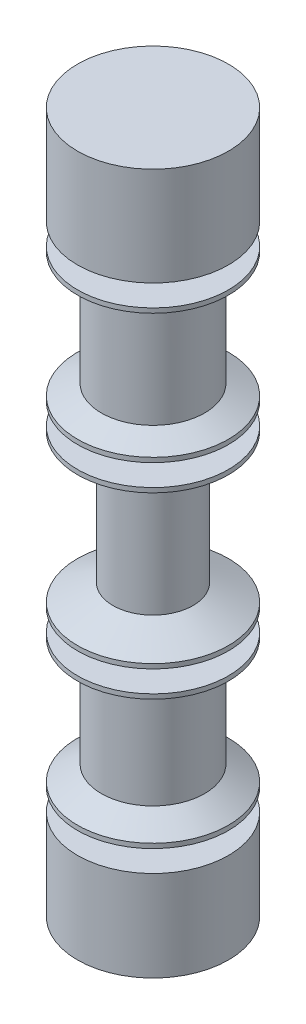
ISO-10303-21;
HEADER;
FILE_DESCRIPTION(('STEP AP214'),'2;1');
FILE_NAME('part.step','',(''),(''),'','','');
FILE_SCHEMA(('AUTOMOTIVE_DESIGN { 1 0 10303 214 1 1 1 1 }'));
ENDSEC;
DATA;
#1=APPLICATION_CONTEXT('core data for automotive mechanical design processes');
#2=APPLICATION_PROTOCOL_DEFINITION('international standard','automotive_design',2000,#1);
#3=PRODUCT_CONTEXT('',#1,'mechanical');
#4=PRODUCT('Part','Part','',(#3));
#5=PRODUCT_RELATED_PRODUCT_CATEGORY('part','',(#4));
#6=PRODUCT_DEFINITION_FORMATION('','',#4);
#7=PRODUCT_DEFINITION_CONTEXT('part definition',#1,'design');
#8=PRODUCT_DEFINITION('design','',#6,#7);
#9=PRODUCT_DEFINITION_SHAPE('','',#8);
#10=(LENGTH_UNIT() NAMED_UNIT(*) SI_UNIT(.MILLI.,.METRE.));
#11=(NAMED_UNIT(*) PLANE_ANGLE_UNIT() SI_UNIT($,.RADIAN.));
#12=(NAMED_UNIT(*) SI_UNIT($,.STERADIAN.) SOLID_ANGLE_UNIT());
#13=UNCERTAINTY_MEASURE_WITH_UNIT(LENGTH_MEASURE(1.E-05),#10,'distance_accuracy_value','');
#14=(GEOMETRIC_REPRESENTATION_CONTEXT(3) GLOBAL_UNCERTAINTY_ASSIGNED_CONTEXT((#13)) GLOBAL_UNIT_ASSIGNED_CONTEXT((#10,
#11,#12)) REPRESENTATION_CONTEXT('',''));
#15=CARTESIAN_POINT('',(0.,0.,0.));
#16=DIRECTION('',(0.,0.,1.));
#17=DIRECTION('',(1.,0.,0.));
#18=AXIS2_PLACEMENT_3D('',#15,#16,#17);
#19=CARTESIAN_POINT('',(0.,-23.,0.));
#20=DIRECTION('',(0.,1.,0.));
#21=DIRECTION('',(0.,0.,1.));
#22=AXIS2_PLACEMENT_3D('',#19,#20,#21);
#23=CYLINDRICAL_SURFACE('',#22,4.9);
#24=CARTESIAN_POINT('',(0.,-16.6,0.));
#25=DIRECTION('',(0.,1.,0.));
#26=DIRECTION('',(0.,0.,1.));
#27=AXIS2_PLACEMENT_3D('',#24,#25,#26);
#28=CIRCLE('',#27,4.9);
#29=CARTESIAN_POINT('',(0.,-16.6,4.9));
#30=VERTEX_POINT('',#29);
#31=EDGE_CURVE('E55',#30,#30,#28,.T.);
#32=ORIENTED_EDGE('',*,*,#31,.F.);
#33=EDGE_LOOP('',(#32));
#34=FACE_BOUND('',#33,.T.);
#35=CARTESIAN_POINT('',(0.,-22.4803847577293,0.));
#36=DIRECTION('',(0.,1.,0.));
#37=DIRECTION('',(0.,0.,1.));
#38=AXIS2_PLACEMENT_3D('',#35,#36,#37);
#39=CIRCLE('',#38,4.9);
#40=CARTESIAN_POINT('',(0.,-22.4803847577293,4.9));
#41=VERTEX_POINT('',#40);
#42=EDGE_CURVE('E530',#41,#41,#39,.T.);
#43=ORIENTED_EDGE('',*,*,#42,.T.);
#44=EDGE_LOOP('',(#43));
#45=FACE_BOUND('',#44,.T.);
#46=ADVANCED_FACE('F33',(#34,#45),#23,.T.);
#47=CARTESIAN_POINT('',(0.,3.7,0.));
#48=DIRECTION('',(0.,-1.,0.));
#49=DIRECTION('',(0.,0.,-1.));
#50=AXIS2_PLACEMENT_3D('',#47,#48,#49);
#51=CYLINDRICAL_SURFACE('',#50,2.6);
#52=CARTESIAN_POINT('',(0.,3.7,0.));
#53=DIRECTION('',(0.,1.,0.));
#54=DIRECTION('',(0.,0.,1.));
#55=AXIS2_PLACEMENT_3D('',#52,#53,#54);
#56=CIRCLE('',#55,2.6);
#57=CARTESIAN_POINT('',(0.,3.7,2.6));
#58=VERTEX_POINT('',#57);
#59=EDGE_CURVE('E37',#58,#58,#56,.T.);
#60=ORIENTED_EDGE('',*,*,#59,.F.);
#61=EDGE_LOOP('',(#60));
#62=FACE_BOUND('',#61,.T.);
#63=CARTESIAN_POINT('',(0.,-3.7,0.));
#64=DIRECTION('',(0.,1.,0.));
#65=DIRECTION('',(-1.,0.,0.));
#66=AXIS2_PLACEMENT_3D('',#63,#64,#65);
#67=CIRCLE('',#66,2.6);
#68=CARTESIAN_POINT('',(-2.6,-3.7,0.));
#69=VERTEX_POINT('',#68);
#70=EDGE_CURVE('E101',#69,#69,#67,.T.);
#71=ORIENTED_EDGE('',*,*,#70,.T.);
#72=EDGE_LOOP('',(#71));
#73=FACE_BOUND('',#72,.T.);
#74=ADVANCED_FACE('F35',(#62,#73),#51,.T.);
#75=CARTESIAN_POINT('',(0.,3.7,0.));
#76=DIRECTION('',(0.,1.,0.));
#77=DIRECTION('',(-1.,0.,0.));
#78=AXIS2_PLACEMENT_3D('',#75,#76,#77);
#79=CONICAL_SURFACE('',#78,2.6,1.12469077785149);
#80=CARTESIAN_POINT('',(0.,4.8,0.));
#81=DIRECTION('',(0.,1.,0.));
#82=DIRECTION('',(-1.,0.,0.));
#83=AXIS2_PLACEMENT_3D('',#80,#81,#82);
#84=CIRCLE('',#83,4.9);
#85=CARTESIAN_POINT('',(-4.9,4.8,0.));
#86=VERTEX_POINT('',#85);
#87=EDGE_CURVE('E138',#86,#86,#84,.T.);
#88=ORIENTED_EDGE('',*,*,#87,.F.);
#89=EDGE_LOOP('',(#88));
#90=FACE_BOUND('',#89,.T.);
#91=ORIENTED_EDGE('',*,*,#59,.T.);
#92=EDGE_LOOP('',(#91));
#93=FACE_BOUND('',#92,.T.);
#94=ADVANCED_FACE('F145',(#90,#93),#79,.T.);
#95=CARTESIAN_POINT('',(0.,5.1,0.));
#96=DIRECTION('',(0.,1.,0.));
#97=DIRECTION('',(-1.,0.,0.));
#98=AXIS2_PLACEMENT_3D('',#95,#96,#97);
#99=CYLINDRICAL_SURFACE('',#98,4.9);
#100=CARTESIAN_POINT('',(0.,5.1,0.));
#101=DIRECTION('',(0.,1.,0.));
#102=DIRECTION('',(-1.,0.,0.));
#103=AXIS2_PLACEMENT_3D('',#100,#101,#102);
#104=CIRCLE('',#103,4.9);
#105=CARTESIAN_POINT('',(-4.9,5.1,0.));
#106=VERTEX_POINT('',#105);
#107=EDGE_CURVE('E134',#106,#106,#104,.T.);
#108=ORIENTED_EDGE('',*,*,#107,.F.);
#109=EDGE_LOOP('',(#108));
#110=FACE_BOUND('',#109,.T.);
#111=ORIENTED_EDGE('',*,*,#87,.T.);
#112=EDGE_LOOP('',(#111));
#113=FACE_BOUND('',#112,.T.);
#114=ADVANCED_FACE('F465',(#110,#113),#99,.T.);
#115=CARTESIAN_POINT('',(4.9,5.1,0.));
#116=DIRECTION('',(0.,-1.,0.));
#117=DIRECTION('',(1.,0.,0.));
#118=AXIS2_PLACEMENT_3D('',#115,#116,#117);
#119=PLANE('',#118);
#120=CARTESIAN_POINT('',(0.,5.1,0.));
#121=DIRECTION('',(0.,1.,0.));
#122=DIRECTION('',(-1.,0.,0.));
#123=AXIS2_PLACEMENT_3D('',#120,#121,#122);
#124=CIRCLE('',#123,2.5);
#125=CARTESIAN_POINT('',(-2.5,5.1,0.));
#126=VERTEX_POINT('',#125);
#127=EDGE_CURVE('E41',#126,#126,#124,.T.);
#128=ORIENTED_EDGE('',*,*,#127,.F.);
#129=EDGE_LOOP('',(#128));
#130=FACE_BOUND('',#129,.T.);
#131=ORIENTED_EDGE('',*,*,#107,.T.);
#132=EDGE_LOOP('',(#131));
#133=FACE_BOUND('',#132,.T.);
#134=ADVANCED_FACE('F456',(#130,#133),#119,.F.);
#135=CARTESIAN_POINT('',(0.,6.5,0.));
#136=DIRECTION('',(0.,-1.,0.));
#137=DIRECTION('',(1.,0.,0.));
#138=AXIS2_PLACEMENT_3D('',#135,#136,#137);
#139=CYLINDRICAL_SURFACE('',#138,2.5);
#140=CARTESIAN_POINT('',(0.,6.5,0.));
#141=DIRECTION('',(0.,1.,0.));
#142=DIRECTION('',(-1.,0.,0.));
#143=AXIS2_PLACEMENT_3D('',#140,#141,#142);
#144=CIRCLE('',#143,2.5);
#145=CARTESIAN_POINT('',(-2.5,6.5,0.));
#146=VERTEX_POINT('',#145);
#147=EDGE_CURVE('E131',#146,#146,#144,.T.);
#148=ORIENTED_EDGE('',*,*,#147,.F.);
#149=EDGE_LOOP('',(#148));
#150=FACE_BOUND('',#149,.T.);
#151=ORIENTED_EDGE('',*,*,#127,.T.);
#152=EDGE_LOOP('',(#151));
#153=FACE_BOUND('',#152,.T.);
#154=ADVANCED_FACE('F447',(#150,#153),#139,.T.);
#155=CARTESIAN_POINT('',(0.,6.5,0.));
#156=DIRECTION('',(0.,-1.,0.));
#157=DIRECTION('',(0.,0.,-1.));
#158=AXIS2_PLACEMENT_3D('',#155,#156,#157);
#159=PLANE('',#158);
#160=ORIENTED_EDGE('',*,*,#147,.T.);
#161=EDGE_LOOP('',(#160));
#162=FACE_BOUND('',#161,.T.);
#163=CARTESIAN_POINT('',(0.,6.5,0.));
#164=DIRECTION('',(0.,-1.,0.));
#165=DIRECTION('',(0.,0.,-1.));
#166=AXIS2_PLACEMENT_3D('',#163,#164,#165);
#167=CIRCLE('',#166,4.9);
#168=CARTESIAN_POINT('',(0.,6.5,-4.9));
#169=VERTEX_POINT('',#168);
#170=EDGE_CURVE('E128',#169,#169,#167,.T.);
#171=ORIENTED_EDGE('',*,*,#170,.T.);
#172=EDGE_LOOP('',(#171));
#173=FACE_BOUND('',#172,.T.);
#174=ADVANCED_FACE('F438',(#162,#173),#159,.T.);
#175=CARTESIAN_POINT('',(0.,6.5,0.));
#176=DIRECTION('',(0.,-1.,0.));
#177=DIRECTION('',(0.,0.,-1.));
#178=AXIS2_PLACEMENT_3D('',#175,#176,#177);
#179=CYLINDRICAL_SURFACE('',#178,4.9);
#180=CARTESIAN_POINT('',(0.,6.8,0.));
#181=DIRECTION('',(0.,-1.,0.));
#182=DIRECTION('',(0.,0.,-1.));
#183=AXIS2_PLACEMENT_3D('',#180,#181,#182);
#184=CIRCLE('',#183,4.9);
#185=CARTESIAN_POINT('',(0.,6.8,-4.9));
#186=VERTEX_POINT('',#185);
#187=EDGE_CURVE('E123',#186,#186,#184,.T.);
#188=ORIENTED_EDGE('',*,*,#187,.T.);
#189=EDGE_LOOP('',(#188));
#190=FACE_BOUND('',#189,.T.);
#191=ORIENTED_EDGE('',*,*,#170,.F.);
#192=EDGE_LOOP('',(#191));
#193=FACE_BOUND('',#192,.T.);
#194=ADVANCED_FACE('F429',(#190,#193),#179,.T.);
#195=CARTESIAN_POINT('',(0.,6.8,0.));
#196=DIRECTION('',(0.,-1.,0.));
#197=DIRECTION('',(0.,0.,-1.));
#198=AXIS2_PLACEMENT_3D('',#195,#196,#197);
#199=CONICAL_SURFACE('',#198,4.9,1.14660191889113);
#200=CARTESIAN_POINT('',(0.,7.5,0.));
#201=DIRECTION('',(0.,1.,0.));
#202=DIRECTION('',(-1.,0.,0.));
#203=AXIS2_PLACEMENT_3D('',#200,#201,#202);
#204=CIRCLE('',#203,3.35000000000001);
#205=CARTESIAN_POINT('',(-3.35000000000001,7.5,0.));
#206=VERTEX_POINT('',#205);
#207=EDGE_CURVE('E119',#206,#206,#204,.T.);
#208=ORIENTED_EDGE('',*,*,#207,.F.);
#209=EDGE_LOOP('',(#208));
#210=FACE_BOUND('',#209,.T.);
#211=ORIENTED_EDGE('',*,*,#187,.F.);
#212=EDGE_LOOP('',(#211));
#213=FACE_BOUND('',#212,.T.);
#214=ADVANCED_FACE('F420',(#210,#213),#199,.T.);
#215=CARTESIAN_POINT('',(0.,13.9,0.));
#216=DIRECTION('',(0.,-1.,0.));
#217=DIRECTION('',(1.,0.,0.));
#218=AXIS2_PLACEMENT_3D('',#215,#216,#217);
#219=CYLINDRICAL_SURFACE('',#218,3.35000000000001);
#220=CARTESIAN_POINT('',(0.,13.9,0.));
#221=DIRECTION('',(0.,1.,0.));
#222=DIRECTION('',(-1.,0.,0.));
#223=AXIS2_PLACEMENT_3D('',#220,#221,#222);
#224=CIRCLE('',#223,3.35000000000001);
#225=CARTESIAN_POINT('',(-3.35000000000001,13.9,0.));
#226=VERTEX_POINT('',#225);
#227=EDGE_CURVE('E120',#226,#226,#224,.T.);
#228=ORIENTED_EDGE('',*,*,#227,.F.);
#229=EDGE_LOOP('',(#228));
#230=FACE_BOUND('',#229,.T.);
#231=ORIENTED_EDGE('',*,*,#207,.T.);
#232=EDGE_LOOP('',(#231));
#233=FACE_BOUND('',#232,.T.);
#234=ADVANCED_FACE('F412',(#230,#233),#219,.T.);
#235=CARTESIAN_POINT('',(0.,15.2,0.));
#236=DIRECTION('',(0.,1.,0.));
#237=DIRECTION('',(0.,0.,1.));
#238=AXIS2_PLACEMENT_3D('',#235,#236,#237);
#239=PLANE('',#238);
#240=CARTESIAN_POINT('',(0.,15.2,0.));
#241=DIRECTION('',(0.,1.,0.));
#242=DIRECTION('',(0.,0.,1.));
#243=AXIS2_PLACEMENT_3D('',#240,#241,#242);
#244=CIRCLE('',#243,2.5);
#245=CARTESIAN_POINT('',(0.,15.2,2.5));
#246=VERTEX_POINT('',#245);
#247=EDGE_CURVE('E12',#246,#246,#244,.T.);
#248=ORIENTED_EDGE('',*,*,#247,.F.);
#249=EDGE_LOOP('',(#248));
#250=FACE_BOUND('',#249,.T.);
#251=CARTESIAN_POINT('',(0.,15.2,0.));
#252=DIRECTION('',(0.,-1.,0.));
#253=DIRECTION('',(0.,0.,-1.));
#254=AXIS2_PLACEMENT_3D('',#251,#252,#253);
#255=CIRCLE('',#254,4.9);
#256=CARTESIAN_POINT('',(0.,15.2,-4.9));
#257=VERTEX_POINT('',#256);
#258=EDGE_CURVE('E116',#257,#257,#255,.T.);
#259=ORIENTED_EDGE('',*,*,#258,.F.);
#260=EDGE_LOOP('',(#259));
#261=FACE_BOUND('',#260,.T.);
#262=ADVANCED_FACE('F403',(#250,#261),#239,.T.);
#263=CARTESIAN_POINT('',(0.,13.9,0.));
#264=DIRECTION('',(0.,-1.,0.));
#265=DIRECTION('',(0.,0.,-1.));
#266=AXIS2_PLACEMENT_3D('',#263,#264,#265);
#267=CYLINDRICAL_SURFACE('',#266,4.9);
#268=ORIENTED_EDGE('',*,*,#258,.T.);
#269=EDGE_LOOP('',(#268));
#270=FACE_BOUND('',#269,.T.);
#271=CARTESIAN_POINT('',(0.,14.9,0.));
#272=DIRECTION('',(0.,-1.,0.));
#273=DIRECTION('',(0.,0.,-1.));
#274=AXIS2_PLACEMENT_3D('',#271,#272,#273);
#275=CIRCLE('',#274,4.9);
#276=CARTESIAN_POINT('',(0.,14.9,-4.9));
#277=VERTEX_POINT('',#276);
#278=EDGE_CURVE('E112',#277,#277,#275,.T.);
#279=ORIENTED_EDGE('',*,*,#278,.F.);
#280=EDGE_LOOP('',(#279));
#281=FACE_BOUND('',#280,.T.);
#282=ADVANCED_FACE('F394',(#270,#281),#267,.T.);
#283=CARTESIAN_POINT('',(0.,13.9,0.));
#284=DIRECTION('',(0.,1.,0.));
#285=DIRECTION('',(0.,0.,1.));
#286=AXIS2_PLACEMENT_3D('',#283,#284,#285);
#287=CONICAL_SURFACE('',#286,3.35,0.997830183906191);
#288=ORIENTED_EDGE('',*,*,#278,.T.);
#289=EDGE_LOOP('',(#288));
#290=FACE_BOUND('',#289,.T.);
#291=ORIENTED_EDGE('',*,*,#227,.T.);
#292=EDGE_LOOP('',(#291));
#293=FACE_BOUND('',#292,.T.);
#294=ADVANCED_FACE('F384',(#290,#293),#287,.T.);
#295=CARTESIAN_POINT('',(0.,16.6,0.));
#296=DIRECTION('',(0.,-1.,0.));
#297=DIRECTION('',(0.,0.,-1.));
#298=AXIS2_PLACEMENT_3D('',#295,#296,#297);
#299=CYLINDRICAL_SURFACE('',#298,2.5);
#300=CARTESIAN_POINT('',(0.,16.6,0.));
#301=DIRECTION('',(0.,1.,0.));
#302=DIRECTION('',(0.,0.,1.));
#303=AXIS2_PLACEMENT_3D('',#300,#301,#302);
#304=CIRCLE('',#303,2.5);
#305=CARTESIAN_POINT('',(0.,16.6,2.5));
#306=VERTEX_POINT('',#305);
#307=EDGE_CURVE('E108',#306,#306,#304,.T.);
#308=ORIENTED_EDGE('',*,*,#307,.F.);
#309=EDGE_LOOP('',(#308));
#310=FACE_BOUND('',#309,.T.);
#311=ORIENTED_EDGE('',*,*,#247,.T.);
#312=EDGE_LOOP('',(#311));
#313=FACE_BOUND('',#312,.T.);
#314=ADVANCED_FACE('F375',(#310,#313),#299,.T.);
#315=CARTESIAN_POINT('',(0.,23.,0.));
#316=DIRECTION('',(0.,-1.,0.));
#317=DIRECTION('',(0.,0.,-1.));
#318=AXIS2_PLACEMENT_3D('',#315,#316,#317);
#319=CYLINDRICAL_SURFACE('',#318,4.9);
#320=CARTESIAN_POINT('',(0.,23.,0.));
#321=DIRECTION('',(0.,1.,0.));
#322=DIRECTION('',(0.,0.,1.));
#323=AXIS2_PLACEMENT_3D('',#320,#321,#322);
#324=CIRCLE('',#323,4.9);
#325=CARTESIAN_POINT('',(0.,23.,4.9));
#326=VERTEX_POINT('',#325);
#327=EDGE_CURVE('E105',#326,#326,#324,.T.);
#328=ORIENTED_EDGE('',*,*,#327,.F.);
#329=EDGE_LOOP('',(#328));
#330=FACE_BOUND('',#329,.T.);
#331=CARTESIAN_POINT('',(0.,16.6,0.));
#332=DIRECTION('',(0.,1.,0.));
#333=DIRECTION('',(0.,0.,1.));
#334=AXIS2_PLACEMENT_3D('',#331,#332,#333);
#335=CIRCLE('',#334,4.9);
#336=CARTESIAN_POINT('',(0.,16.6,4.9));
#337=VERTEX_POINT('',#336);
#338=EDGE_CURVE('E104',#337,#337,#335,.T.);
#339=ORIENTED_EDGE('',*,*,#338,.T.);
#340=EDGE_LOOP('',(#339));
#341=FACE_BOUND('',#340,.T.);
#342=ADVANCED_FACE('F367',(#330,#341),#319,.T.);
#343=CARTESIAN_POINT('',(0.,23.,0.));
#344=DIRECTION('',(0.,1.,0.));
#345=DIRECTION('',(0.,0.,1.));
#346=AXIS2_PLACEMENT_3D('',#343,#344,#345);
#347=PLANE('',#346);
#348=ORIENTED_EDGE('',*,*,#327,.T.);
#349=EDGE_LOOP('',(#348));
#350=FACE_BOUND('',#349,.T.);
#351=ADVANCED_FACE('F164',(#350),#347,.T.);
#352=CARTESIAN_POINT('',(0.,16.6,0.));
#353=DIRECTION('',(0.,1.,0.));
#354=DIRECTION('',(0.,0.,1.));
#355=AXIS2_PLACEMENT_3D('',#352,#353,#354);
#356=PLANE('',#355);
#357=ORIENTED_EDGE('',*,*,#307,.T.);
#358=EDGE_LOOP('',(#357));
#359=FACE_BOUND('',#358,.T.);
#360=ORIENTED_EDGE('',*,*,#338,.F.);
#361=EDGE_LOOP('',(#360));
#362=FACE_BOUND('',#361,.T.);
#363=ADVANCED_FACE('F154',(#359,#362),#356,.F.);
#364=CARTESIAN_POINT('',(0.,-3.7,0.));
#365=DIRECTION('',(0.,-1.,0.));
#366=DIRECTION('',(-1.,0.,0.));
#367=AXIS2_PLACEMENT_3D('',#364,#365,#366);
#368=CONICAL_SURFACE('',#367,2.6,1.12469077785149);
#369=CARTESIAN_POINT('',(0.,-4.8,0.));
#370=DIRECTION('',(0.,1.,0.));
#371=DIRECTION('',(-1.,0.,0.));
#372=AXIS2_PLACEMENT_3D('',#369,#370,#371);
#373=CIRCLE('',#372,4.9);
#374=CARTESIAN_POINT('',(-4.9,-4.8,0.));
#375=VERTEX_POINT('',#374);
#376=EDGE_CURVE('E98',#375,#375,#373,.T.);
#377=ORIENTED_EDGE('',*,*,#376,.T.);
#378=EDGE_LOOP('',(#377));
#379=FACE_BOUND('',#378,.T.);
#380=ORIENTED_EDGE('',*,*,#70,.F.);
#381=EDGE_LOOP('',(#380));
#382=FACE_BOUND('',#381,.T.);
#383=ADVANCED_FACE('F151',(#379,#382),#368,.T.);
#384=CARTESIAN_POINT('',(0.,-5.1,0.));
#385=DIRECTION('',(0.,-1.,0.));
#386=DIRECTION('',(-1.,0.,0.));
#387=AXIS2_PLACEMENT_3D('',#384,#385,#386);
#388=CYLINDRICAL_SURFACE('',#387,4.9);
#389=CARTESIAN_POINT('',(0.,-5.1,0.));
#390=DIRECTION('',(0.,1.,0.));
#391=DIRECTION('',(-1.,0.,0.));
#392=AXIS2_PLACEMENT_3D('',#389,#390,#391);
#393=CIRCLE('',#392,4.9);
#394=CARTESIAN_POINT('',(-4.9,-5.1,0.));
#395=VERTEX_POINT('',#394);
#396=EDGE_CURVE('E95',#395,#395,#393,.T.);
#397=ORIENTED_EDGE('',*,*,#396,.T.);
#398=EDGE_LOOP('',(#397));
#399=FACE_BOUND('',#398,.T.);
#400=ORIENTED_EDGE('',*,*,#376,.F.);
#401=EDGE_LOOP('',(#400));
#402=FACE_BOUND('',#401,.T.);
#403=ADVANCED_FACE('F153',(#399,#402),#388,.T.);
#404=CARTESIAN_POINT('',(4.9,-5.1,0.));
#405=DIRECTION('',(0.,1.,0.));
#406=DIRECTION('',(1.,0.,0.));
#407=AXIS2_PLACEMENT_3D('',#404,#405,#406);
#408=PLANE('',#407);
#409=CARTESIAN_POINT('',(0.,-5.1,0.));
#410=DIRECTION('',(0.,1.,0.));
#411=DIRECTION('',(-1.,0.,0.));
#412=AXIS2_PLACEMENT_3D('',#409,#410,#411);
#413=CIRCLE('',#412,2.5);
#414=CARTESIAN_POINT('',(-2.5,-5.1,0.));
#415=VERTEX_POINT('',#414);
#416=EDGE_CURVE('E92',#415,#415,#413,.T.);
#417=ORIENTED_EDGE('',*,*,#416,.T.);
#418=EDGE_LOOP('',(#417));
#419=FACE_BOUND('',#418,.T.);
#420=ORIENTED_EDGE('',*,*,#396,.F.);
#421=EDGE_LOOP('',(#420));
#422=FACE_BOUND('',#421,.T.);
#423=ADVANCED_FACE('F161',(#419,#422),#408,.F.);
#424=CARTESIAN_POINT('',(0.,-6.5,0.));
#425=DIRECTION('',(0.,1.,0.));
#426=DIRECTION('',(-1.,0.,0.));
#427=AXIS2_PLACEMENT_3D('',#424,#425,#426);
#428=CYLINDRICAL_SURFACE('',#427,2.5);
#429=CARTESIAN_POINT('',(0.,-6.5,0.));
#430=DIRECTION('',(0.,1.,0.));
#431=DIRECTION('',(-1.,0.,0.));
#432=AXIS2_PLACEMENT_3D('',#429,#430,#431);
#433=CIRCLE('',#432,2.5);
#434=CARTESIAN_POINT('',(-2.5,-6.5,0.));
#435=VERTEX_POINT('',#434);
#436=EDGE_CURVE('E89',#435,#435,#433,.T.);
#437=ORIENTED_EDGE('',*,*,#436,.T.);
#438=EDGE_LOOP('',(#437));
#439=FACE_BOUND('',#438,.T.);
#440=ORIENTED_EDGE('',*,*,#416,.F.);
#441=EDGE_LOOP('',(#440));
#442=FACE_BOUND('',#441,.T.);
#443=ADVANCED_FACE('F210',(#439,#442),#428,.T.);
#444=CARTESIAN_POINT('',(0.,-6.5,0.));
#445=DIRECTION('',(0.,1.,0.));
#446=DIRECTION('',(0.,0.,-1.));
#447=AXIS2_PLACEMENT_3D('',#444,#445,#446);
#448=PLANE('',#447);
#449=ORIENTED_EDGE('',*,*,#436,.F.);
#450=EDGE_LOOP('',(#449));
#451=FACE_BOUND('',#450,.T.);
#452=CARTESIAN_POINT('',(0.,-6.5,0.));
#453=DIRECTION('',(0.,-1.,0.));
#454=DIRECTION('',(0.,0.,-1.));
#455=AXIS2_PLACEMENT_3D('',#452,#453,#454);
#456=CIRCLE('',#455,4.9);
#457=CARTESIAN_POINT('',(0.,-6.5,-4.9));
#458=VERTEX_POINT('',#457);
#459=EDGE_CURVE('E86',#458,#458,#456,.T.);
#460=ORIENTED_EDGE('',*,*,#459,.F.);
#461=EDGE_LOOP('',(#460));
#462=FACE_BOUND('',#461,.T.);
#463=ADVANCED_FACE('F206',(#451,#462),#448,.T.);
#464=CARTESIAN_POINT('',(0.,-6.5,0.));
#465=DIRECTION('',(0.,1.,0.));
#466=DIRECTION('',(0.,0.,-1.));
#467=AXIS2_PLACEMENT_3D('',#464,#465,#466);
#468=CYLINDRICAL_SURFACE('',#467,4.9);
#469=CARTESIAN_POINT('',(0.,-6.8,0.));
#470=DIRECTION('',(0.,-1.,0.));
#471=DIRECTION('',(0.,0.,-1.));
#472=AXIS2_PLACEMENT_3D('',#469,#470,#471);
#473=CIRCLE('',#472,4.9);
#474=CARTESIAN_POINT('',(0.,-6.8,-4.9));
#475=VERTEX_POINT('',#474);
#476=EDGE_CURVE('E83',#475,#475,#473,.T.);
#477=ORIENTED_EDGE('',*,*,#476,.F.);
#478=EDGE_LOOP('',(#477));
#479=FACE_BOUND('',#478,.T.);
#480=ORIENTED_EDGE('',*,*,#459,.T.);
#481=EDGE_LOOP('',(#480));
#482=FACE_BOUND('',#481,.T.);
#483=ADVANCED_FACE('F202',(#479,#482),#468,.T.);
#484=CARTESIAN_POINT('',(0.,-6.8,0.));
#485=DIRECTION('',(0.,1.,0.));
#486=DIRECTION('',(0.,0.,-1.));
#487=AXIS2_PLACEMENT_3D('',#484,#485,#486);
#488=CONICAL_SURFACE('',#487,4.9,1.14660191889113);
#489=CARTESIAN_POINT('',(0.,-7.5,0.));
#490=DIRECTION('',(0.,-1.,0.));
#491=DIRECTION('',(0.,0.,-1.));
#492=AXIS2_PLACEMENT_3D('',#489,#490,#491);
#493=CIRCLE('',#492,3.35);
#494=CARTESIAN_POINT('',(0.,-7.5,-3.35));
#495=VERTEX_POINT('',#494);
#496=EDGE_CURVE('E80',#495,#495,#493,.T.);
#497=ORIENTED_EDGE('',*,*,#496,.F.);
#498=EDGE_LOOP('',(#497));
#499=FACE_BOUND('',#498,.T.);
#500=ORIENTED_EDGE('',*,*,#476,.T.);
#501=EDGE_LOOP('',(#500));
#502=FACE_BOUND('',#501,.T.);
#503=ADVANCED_FACE('F198',(#499,#502),#488,.T.);
#504=CARTESIAN_POINT('',(0.,-13.9,0.));
#505=DIRECTION('',(0.,1.,0.));
#506=DIRECTION('',(-1.,0.,0.));
#507=AXIS2_PLACEMENT_3D('',#504,#505,#506);
#508=CYLINDRICAL_SURFACE('',#507,3.35000000000001);
#509=CARTESIAN_POINT('',(0.,-13.9,0.));
#510=DIRECTION('',(0.,-1.,0.));
#511=DIRECTION('',(0.,0.,-1.));
#512=AXIS2_PLACEMENT_3D('',#509,#510,#511);
#513=CIRCLE('',#512,3.35);
#514=CARTESIAN_POINT('',(0.,-13.9,-3.35));
#515=VERTEX_POINT('',#514);
#516=EDGE_CURVE('E71',#515,#515,#513,.T.);
#517=ORIENTED_EDGE('',*,*,#516,.F.);
#518=EDGE_LOOP('',(#517));
#519=FACE_BOUND('',#518,.T.);
#520=ORIENTED_EDGE('',*,*,#496,.T.);
#521=EDGE_LOOP('',(#520));
#522=FACE_BOUND('',#521,.T.);
#523=ADVANCED_FACE('F194',(#519,#522),#508,.T.);
#524=CARTESIAN_POINT('',(0.,-15.2,0.));
#525=DIRECTION('',(0.,-1.,0.));
#526=DIRECTION('',(0.,0.,1.));
#527=AXIS2_PLACEMENT_3D('',#524,#525,#526);
#528=PLANE('',#527);
#529=CARTESIAN_POINT('',(0.,-15.2,0.));
#530=DIRECTION('',(0.,1.,0.));
#531=DIRECTION('',(0.,0.,1.));
#532=AXIS2_PLACEMENT_3D('',#529,#530,#531);
#533=CIRCLE('',#532,2.5);
#534=CARTESIAN_POINT('',(0.,-15.2,2.5));
#535=VERTEX_POINT('',#534);
#536=EDGE_CURVE('E68',#535,#535,#533,.T.);
#537=ORIENTED_EDGE('',*,*,#536,.T.);
#538=EDGE_LOOP('',(#537));
#539=FACE_BOUND('',#538,.T.);
#540=CARTESIAN_POINT('',(0.,-15.2,0.));
#541=DIRECTION('',(0.,-1.,0.));
#542=DIRECTION('',(0.,0.,-1.));
#543=AXIS2_PLACEMENT_3D('',#540,#541,#542);
#544=CIRCLE('',#543,4.9);
#545=CARTESIAN_POINT('',(0.,-15.2,-4.9));
#546=VERTEX_POINT('',#545);
#547=EDGE_CURVE('E77',#546,#546,#544,.T.);
#548=ORIENTED_EDGE('',*,*,#547,.T.);
#549=EDGE_LOOP('',(#548));
#550=FACE_BOUND('',#549,.T.);
#551=ADVANCED_FACE('F190',(#539,#550),#528,.T.);
#552=CARTESIAN_POINT('',(0.,-13.9,0.));
#553=DIRECTION('',(0.,1.,0.));
#554=DIRECTION('',(0.,0.,-1.));
#555=AXIS2_PLACEMENT_3D('',#552,#553,#554);
#556=CYLINDRICAL_SURFACE('',#555,4.9);
#557=ORIENTED_EDGE('',*,*,#547,.F.);
#558=EDGE_LOOP('',(#557));
#559=FACE_BOUND('',#558,.T.);
#560=CARTESIAN_POINT('',(0.,-14.9,0.));
#561=DIRECTION('',(0.,-1.,0.));
#562=DIRECTION('',(0.,0.,-1.));
#563=AXIS2_PLACEMENT_3D('',#560,#561,#562);
#564=CIRCLE('',#563,4.9);
#565=CARTESIAN_POINT('',(0.,-14.9,-4.9));
#566=VERTEX_POINT('',#565);
#567=EDGE_CURVE('E74',#566,#566,#564,.T.);
#568=ORIENTED_EDGE('',*,*,#567,.T.);
#569=EDGE_LOOP('',(#568));
#570=FACE_BOUND('',#569,.T.);
#571=ADVANCED_FACE('F186',(#559,#570),#556,.T.);
#572=CARTESIAN_POINT('',(0.,-13.9,0.));
#573=DIRECTION('',(0.,-1.,0.));
#574=DIRECTION('',(0.,0.,1.));
#575=AXIS2_PLACEMENT_3D('',#572,#573,#574);
#576=CONICAL_SURFACE('',#575,3.35,0.997830183906191);
#577=ORIENTED_EDGE('',*,*,#567,.F.);
#578=EDGE_LOOP('',(#577));
#579=FACE_BOUND('',#578,.T.);
#580=ORIENTED_EDGE('',*,*,#516,.T.);
#581=EDGE_LOOP('',(#580));
#582=FACE_BOUND('',#581,.T.);
#583=ADVANCED_FACE('F182',(#579,#582),#576,.T.);
#584=CARTESIAN_POINT('',(0.,-16.6,0.));
#585=DIRECTION('',(0.,1.,0.));
#586=DIRECTION('',(0.,0.,1.));
#587=AXIS2_PLACEMENT_3D('',#584,#585,#586);
#588=CYLINDRICAL_SURFACE('',#587,2.5);
#589=CARTESIAN_POINT('',(0.,-16.6,0.));
#590=DIRECTION('',(0.,1.,0.));
#591=DIRECTION('',(0.,0.,1.));
#592=AXIS2_PLACEMENT_3D('',#589,#590,#591);
#593=CIRCLE('',#592,2.5);
#594=CARTESIAN_POINT('',(0.,-16.6,2.5));
#595=VERTEX_POINT('',#594);
#596=EDGE_CURVE('E59',#595,#595,#593,.T.);
#597=ORIENTED_EDGE('',*,*,#596,.T.);
#598=EDGE_LOOP('',(#597));
#599=FACE_BOUND('',#598,.T.);
#600=ORIENTED_EDGE('',*,*,#536,.F.);
#601=EDGE_LOOP('',(#600));
#602=FACE_BOUND('',#601,.T.);
#603=ADVANCED_FACE('F179',(#599,#602),#588,.T.);
#604=CARTESIAN_POINT('',(0.,-16.6,0.));
#605=DIRECTION('',(0.,-1.,0.));
#606=DIRECTION('',(0.,0.,1.));
#607=AXIS2_PLACEMENT_3D('',#604,#605,#606);
#608=PLANE('',#607);
#609=ORIENTED_EDGE('',*,*,#596,.F.);
#610=EDGE_LOOP('',(#609));
#611=FACE_BOUND('',#610,.T.);
#612=ORIENTED_EDGE('',*,*,#31,.T.);
#613=EDGE_LOOP('',(#612));
#614=FACE_BOUND('',#613,.T.);
#615=ADVANCED_FACE('F177',(#611,#614),#608,.F.);
#616=CARTESIAN_POINT('',(0.,-23.,0.));
#617=DIRECTION('',(0.,1.,0.));
#618=DIRECTION('',(0.,0.,-1.));
#619=AXIS2_PLACEMENT_3D('',#616,#617,#618);
#620=CONICAL_SURFACE('',#619,4.,1.0471975511966);
#621=ORIENTED_EDGE('',*,*,#42,.F.);
#622=EDGE_LOOP('',(#621));
#623=FACE_BOUND('',#622,.T.);
#624=CARTESIAN_POINT('',(0.,-23.,0.));
#625=DIRECTION('',(0.,-1.,0.));
#626=DIRECTION('',(0.,0.,-1.));
#627=AXIS2_PLACEMENT_3D('',#624,#625,#626);
#628=CIRCLE('',#627,4.);
#629=CARTESIAN_POINT('',(0.,-23.,-4.));
#630=VERTEX_POINT('',#629);
#631=EDGE_CURVE('E528',#630,#630,#628,.T.);
#632=ORIENTED_EDGE('',*,*,#631,.F.);
#633=EDGE_LOOP('',(#632));
#634=FACE_BOUND('',#633,.T.);
#635=ADVANCED_FACE('F49',(#623,#634),#620,.T.);
#636=CARTESIAN_POINT('',(0.,-13.6,0.));
#637=DIRECTION('',(0.,-1.,0.));
#638=DIRECTION('',(0.,0.,-1.));
#639=AXIS2_PLACEMENT_3D('',#636,#637,#638);
#640=CONICAL_SURFACE('',#639,2.09999999999999,1.02974425867665);
#641=CARTESIAN_POINT('',(0.,-12.3381927000421,0.));
#642=VERTEX_POINT('',#641);
#643=VERTEX_LOOP('',#642);
#644=FACE_BOUND('',#643,.T.);
#645=CARTESIAN_POINT('',(0.,-13.6,0.));
#646=DIRECTION('',(0.,-1.,0.));
#647=DIRECTION('',(0.,0.,-1.));
#648=AXIS2_PLACEMENT_3D('',#645,#646,#647);
#649=CIRCLE('',#648,2.09999999999999);
#650=CARTESIAN_POINT('',(0.,-13.6,-2.09999999999999));
#651=VERTEX_POINT('',#650);
#652=EDGE_CURVE('E53',#651,#651,#649,.T.);
#653=ORIENTED_EDGE('',*,*,#652,.T.);
#654=EDGE_LOOP('',(#653));
#655=FACE_BOUND('',#654,.T.);
#656=ADVANCED_FACE('F45',(#644,#655),#640,.F.);
#657=CARTESIAN_POINT('',(0.,-23.,0.));
#658=DIRECTION('',(0.,-1.,0.));
#659=DIRECTION('',(0.,0.,-1.));
#660=AXIS2_PLACEMENT_3D('',#657,#658,#659);
#661=CYLINDRICAL_SURFACE('',#660,2.09999999999999);
#662=ORIENTED_EDGE('',*,*,#652,.F.);
#663=EDGE_LOOP('',(#662));
#664=FACE_BOUND('',#663,.T.);
#665=CARTESIAN_POINT('',(0.,-22.6,0.));
#666=DIRECTION('',(0.,-1.,0.));
#667=DIRECTION('',(0.,0.,-1.));
#668=AXIS2_PLACEMENT_3D('',#665,#666,#667);
#669=CIRCLE('',#668,2.1);
#670=CARTESIAN_POINT('',(0.,-22.6,-2.1));
#671=VERTEX_POINT('',#670);
#672=EDGE_CURVE('E56',#671,#671,#669,.T.);
#673=ORIENTED_EDGE('',*,*,#672,.T.);
#674=EDGE_LOOP('',(#673));
#675=FACE_BOUND('',#674,.T.);
#676=ADVANCED_FACE('F48',(#664,#675),#661,.F.);
#677=CARTESIAN_POINT('',(0.,-23.,0.));
#678=DIRECTION('',(0.,-1.,0.));
#679=DIRECTION('',(0.,0.,-1.));
#680=AXIS2_PLACEMENT_3D('',#677,#678,#679);
#681=CONICAL_SURFACE('',#680,2.5,0.785398163397452);
#682=ORIENTED_EDGE('',*,*,#672,.F.);
#683=EDGE_LOOP('',(#682));
#684=FACE_BOUND('',#683,.T.);
#685=CARTESIAN_POINT('',(0.,-23.,0.));
#686=DIRECTION('',(0.,-1.,0.));
#687=DIRECTION('',(0.,0.,-1.));
#688=AXIS2_PLACEMENT_3D('',#685,#686,#687);
#689=CIRCLE('',#688,2.5);
#690=CARTESIAN_POINT('',(0.,-23.,-2.5));
#691=VERTEX_POINT('',#690);
#692=EDGE_CURVE('E62',#691,#691,#689,.T.);
#693=ORIENTED_EDGE('',*,*,#692,.T.);
#694=EDGE_LOOP('',(#693));
#695=FACE_BOUND('',#694,.T.);
#696=ADVANCED_FACE('F287',(#684,#695),#681,.F.);
#697=CARTESIAN_POINT('',(0.,-23.,0.));
#698=DIRECTION('',(0.,-1.,0.));
#699=DIRECTION('',(0.,0.,1.));
#700=AXIS2_PLACEMENT_3D('',#697,#698,#699);
#701=PLANE('',#700);
#702=ORIENTED_EDGE('',*,*,#692,.F.);
#703=EDGE_LOOP('',(#702));
#704=FACE_BOUND('',#703,.T.);
#705=ORIENTED_EDGE('',*,*,#631,.T.);
#706=EDGE_LOOP('',(#705));
#707=FACE_BOUND('',#706,.T.);
#708=ADVANCED_FACE('F294',(#704,#707),#701,.T.);
#709=CLOSED_SHELL('',(#46,#74,#94,#114,#134,#154,#174,#194,#214,#234,#262,#282,#294,#314,#342,
#351,#363,#383,#403,#423,#443,#463,#483,#503,#523,#551,#571,#583,#603,#615,#635,#656,#676,#696,#708));
#710=MANIFOLD_SOLID_BREP('B2',#709);
#711=ADVANCED_BREP_SHAPE_REPRESENTATION('',(#18,#710),#14);
#712=SHAPE_DEFINITION_REPRESENTATION(#9,#711);
ENDSEC;
END-ISO-10303-21;
